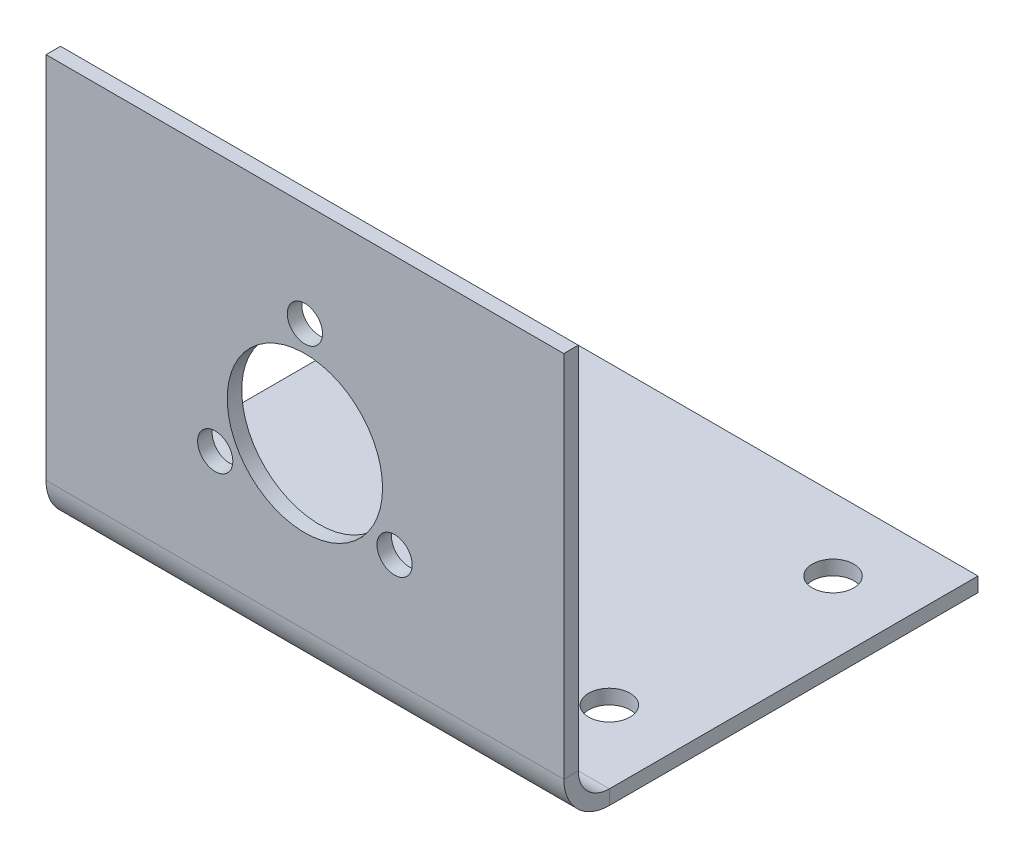
ISO-10303-21;
HEADER;
FILE_DESCRIPTION(('STEP AP214'),'2;1');
FILE_NAME('part.step','',(''),(''),'','','');
FILE_SCHEMA(('AUTOMOTIVE_DESIGN { 1 0 10303 214 1 1 1 1 }'));
ENDSEC;
DATA;
#1=APPLICATION_CONTEXT('core data for automotive mechanical design processes');
#2=APPLICATION_PROTOCOL_DEFINITION('international standard','automotive_design',2000,#1);
#3=PRODUCT_CONTEXT('',#1,'mechanical');
#4=PRODUCT('Part','Part','',(#3));
#5=PRODUCT_RELATED_PRODUCT_CATEGORY('part','',(#4));
#6=PRODUCT_DEFINITION_FORMATION('','',#4);
#7=PRODUCT_DEFINITION_CONTEXT('part definition',#1,'design');
#8=PRODUCT_DEFINITION('design','',#6,#7);
#9=PRODUCT_DEFINITION_SHAPE('','',#8);
#10=(LENGTH_UNIT() NAMED_UNIT(*) SI_UNIT(.MILLI.,.METRE.));
#11=(NAMED_UNIT(*) PLANE_ANGLE_UNIT() SI_UNIT($,.RADIAN.));
#12=(NAMED_UNIT(*) SI_UNIT($,.STERADIAN.) SOLID_ANGLE_UNIT());
#13=UNCERTAINTY_MEASURE_WITH_UNIT(LENGTH_MEASURE(1.E-05),#10,'distance_accuracy_value','');
#14=(GEOMETRIC_REPRESENTATION_CONTEXT(3) GLOBAL_UNCERTAINTY_ASSIGNED_CONTEXT((#13)) GLOBAL_UNIT_ASSIGNED_CONTEXT((#10,
#11,#12)) REPRESENTATION_CONTEXT('',''));
#15=CARTESIAN_POINT('',(0.,0.,0.));
#16=DIRECTION('',(0.,0.,1.));
#17=DIRECTION('',(1.,0.,0.));
#18=AXIS2_PLACEMENT_3D('',#15,#16,#17);
#19=CARTESIAN_POINT('',(0.,0.,-1.4));
#20=DIRECTION('',(-1.,0.,0.));
#21=DIRECTION('',(0.,-1.,0.));
#22=AXIS2_PLACEMENT_3D('',#19,#20,#21);
#23=PLANE('',#22);
#24=DIRECTION('',(0.,-1.,0.));
#25=VECTOR('',#24,1.);
#26=CARTESIAN_POINT('',(0.,0.,-1.4));
#27=LINE('',#26,#25);
#28=CARTESIAN_POINT('',(0.,40.,-1.4));
#29=VERTEX_POINT('',#28);
#30=CARTESIAN_POINT('',(0.,4.39999999999999,-1.4));
#31=VERTEX_POINT('',#30);
#32=EDGE_CURVE('E210',#29,#31,#27,.T.);
#33=ORIENTED_EDGE('',*,*,#32,.T.);
#34=DIRECTION('',(0.,0.,1.));
#35=VECTOR('',#34,1.);
#36=CARTESIAN_POINT('',(0.,4.39999999999999,-1.4));
#37=LINE('',#36,#35);
#38=CARTESIAN_POINT('',(0.,4.39999999999999,0.));
#39=VERTEX_POINT('',#38);
#40=EDGE_CURVE('E173',#31,#39,#37,.T.);
#41=ORIENTED_EDGE('',*,*,#40,.T.);
#42=DIRECTION('',(0.,-1.,0.));
#43=VECTOR('',#42,1.);
#44=CARTESIAN_POINT('',(0.,0.,0.));
#45=LINE('',#44,#43);
#46=CARTESIAN_POINT('',(0.,40.,0.));
#47=VERTEX_POINT('',#46);
#48=EDGE_CURVE('E209',#47,#39,#45,.T.);
#49=ORIENTED_EDGE('',*,*,#48,.F.);
#50=DIRECTION('',(0.,0.,1.));
#51=VECTOR('',#50,1.);
#52=CARTESIAN_POINT('',(0.,40.,-1.4));
#53=LINE('',#52,#51);
#54=EDGE_CURVE('E13',#29,#47,#53,.T.);
#55=ORIENTED_EDGE('',*,*,#54,.F.);
#56=EDGE_LOOP('',(#33,#41,#49,#55));
#57=FACE_BOUND('',#56,.T.);
#58=ADVANCED_FACE('F59',(#57),#23,.T.);
#59=CARTESIAN_POINT('',(0.,0.,-1.4));
#60=DIRECTION('',(0.,0.,-1.));
#61=DIRECTION('',(-1.,0.,0.));
#62=AXIS2_PLACEMENT_3D('',#59,#60,#61);
#63=PLANE('',#62);
#64=CARTESIAN_POINT('',(16.3397459621556,15.,-1.4));
#65=DIRECTION('',(0.,0.,-1.));
#66=DIRECTION('',(-1.,0.,0.));
#67=AXIS2_PLACEMENT_3D('',#64,#65,#66);
#68=CIRCLE('',#67,1.7);
#69=CARTESIAN_POINT('',(18.0397459621556,15.,-1.4));
#70=VERTEX_POINT('',#69);
#71=EDGE_CURVE('E206',#70,#70,#68,.T.);
#72=ORIENTED_EDGE('',*,*,#71,.F.);
#73=EDGE_LOOP('',(#72));
#74=FACE_BOUND('',#73,.T.);
#75=CARTESIAN_POINT('',(25.,30.,-1.4));
#76=DIRECTION('',(0.,0.,-1.));
#77=DIRECTION('',(-1.,0.,0.));
#78=AXIS2_PLACEMENT_3D('',#75,#76,#77);
#79=CIRCLE('',#78,1.7);
#80=CARTESIAN_POINT('',(26.7,30.,-1.4));
#81=VERTEX_POINT('',#80);
#82=EDGE_CURVE('E203',#81,#81,#79,.T.);
#83=ORIENTED_EDGE('',*,*,#82,.F.);
#84=EDGE_LOOP('',(#83));
#85=FACE_BOUND('',#84,.T.);
#86=CARTESIAN_POINT('',(33.6602540378444,15.,-1.4));
#87=DIRECTION('',(0.,0.,-1.));
#88=DIRECTION('',(-1.,0.,0.));
#89=AXIS2_PLACEMENT_3D('',#86,#87,#88);
#90=CIRCLE('',#89,1.69999999999999);
#91=CARTESIAN_POINT('',(35.3602540378444,15.,-1.4));
#92=VERTEX_POINT('',#91);
#93=EDGE_CURVE('E200',#92,#92,#90,.T.);
#94=ORIENTED_EDGE('',*,*,#93,.F.);
#95=EDGE_LOOP('',(#94));
#96=FACE_BOUND('',#95,.T.);
#97=CARTESIAN_POINT('',(25.,20.,-1.4));
#98=DIRECTION('',(0.,0.,-1.));
#99=DIRECTION('',(-1.,0.,0.));
#100=AXIS2_PLACEMENT_3D('',#97,#98,#99);
#101=CIRCLE('',#100,7.49999999999999);
#102=CARTESIAN_POINT('',(32.5,20.,-1.4));
#103=VERTEX_POINT('',#102);
#104=EDGE_CURVE('E197',#103,#103,#101,.T.);
#105=ORIENTED_EDGE('',*,*,#104,.F.);
#106=EDGE_LOOP('',(#105));
#107=FACE_BOUND('',#106,.T.);
#108=DIRECTION('',(0.,1.,0.));
#109=VECTOR('',#108,1.);
#110=CARTESIAN_POINT('',(50.,0.,-1.4));
#111=LINE('',#110,#109);
#112=CARTESIAN_POINT('',(50.,4.39999999999999,-1.4));
#113=VERTEX_POINT('',#112);
#114=CARTESIAN_POINT('',(50.,40.,-1.4));
#115=VERTEX_POINT('',#114);
#116=EDGE_CURVE('E212',#113,#115,#111,.T.);
#117=ORIENTED_EDGE('',*,*,#116,.F.);
#118=DIRECTION('',(-1.,0.,0.));
#119=VECTOR('',#118,1.);
#120=CARTESIAN_POINT('',(0.,4.39999999999999,-1.4));
#121=LINE('',#120,#119);
#122=EDGE_CURVE('E80',#31,#113,#121,.F.);
#123=ORIENTED_EDGE('',*,*,#122,.F.);
#124=ORIENTED_EDGE('',*,*,#32,.F.);
#125=DIRECTION('',(-1.,0.,0.));
#126=VECTOR('',#125,1.);
#127=CARTESIAN_POINT('',(0.,40.,-1.4));
#128=LINE('',#127,#126);
#129=EDGE_CURVE('E215',#115,#29,#128,.T.);
#130=ORIENTED_EDGE('',*,*,#129,.F.);
#131=EDGE_LOOP('',(#117,#123,#124,#130));
#132=FACE_BOUND('',#131,.T.);
#133=ADVANCED_FACE('F266',(#74,#85,#96,#107,#132),#63,.T.);
#134=CARTESIAN_POINT('',(0.,0.,0.));
#135=DIRECTION('',(0.,0.,-1.));
#136=DIRECTION('',(-1.,0.,0.));
#137=AXIS2_PLACEMENT_3D('',#134,#135,#136);
#138=PLANE('',#137);
#139=CARTESIAN_POINT('',(25.,20.,0.));
#140=DIRECTION('',(0.,0.,1.));
#141=DIRECTION('',(1.,0.,0.));
#142=AXIS2_PLACEMENT_3D('',#139,#140,#141);
#143=CIRCLE('',#142,7.49999999999999);
#144=CARTESIAN_POINT('',(32.5,20.,0.));
#145=VERTEX_POINT('',#144);
#146=EDGE_CURVE('E189',#145,#145,#143,.T.);
#147=ORIENTED_EDGE('',*,*,#146,.F.);
#148=EDGE_LOOP('',(#147));
#149=FACE_BOUND('',#148,.T.);
#150=CARTESIAN_POINT('',(33.6602540378444,15.,0.));
#151=DIRECTION('',(0.,0.,1.));
#152=DIRECTION('',(1.,0.,0.));
#153=AXIS2_PLACEMENT_3D('',#150,#151,#152);
#154=CIRCLE('',#153,1.69999999999999);
#155=CARTESIAN_POINT('',(35.3602540378444,15.,0.));
#156=VERTEX_POINT('',#155);
#157=EDGE_CURVE('E186',#156,#156,#154,.T.);
#158=ORIENTED_EDGE('',*,*,#157,.F.);
#159=EDGE_LOOP('',(#158));
#160=FACE_BOUND('',#159,.T.);
#161=CARTESIAN_POINT('',(25.,30.,0.));
#162=DIRECTION('',(0.,0.,1.));
#163=DIRECTION('',(1.,0.,0.));
#164=AXIS2_PLACEMENT_3D('',#161,#162,#163);
#165=CIRCLE('',#164,1.7);
#166=CARTESIAN_POINT('',(26.7,30.,0.));
#167=VERTEX_POINT('',#166);
#168=EDGE_CURVE('E190',#167,#167,#165,.T.);
#169=ORIENTED_EDGE('',*,*,#168,.F.);
#170=EDGE_LOOP('',(#169));
#171=FACE_BOUND('',#170,.T.);
#172=CARTESIAN_POINT('',(16.3397459621556,15.,0.));
#173=DIRECTION('',(0.,0.,1.));
#174=DIRECTION('',(1.,0.,0.));
#175=AXIS2_PLACEMENT_3D('',#172,#173,#174);
#176=CIRCLE('',#175,1.7);
#177=CARTESIAN_POINT('',(18.0397459621556,15.,0.));
#178=VERTEX_POINT('',#177);
#179=EDGE_CURVE('E184',#178,#178,#176,.T.);
#180=ORIENTED_EDGE('',*,*,#179,.F.);
#181=EDGE_LOOP('',(#180));
#182=FACE_BOUND('',#181,.T.);
#183=DIRECTION('',(-1.,0.,0.));
#184=VECTOR('',#183,1.);
#185=CARTESIAN_POINT('',(0.,4.39999999999999,0.));
#186=LINE('',#185,#184);
#187=CARTESIAN_POINT('',(50.,4.39999999999999,0.));
#188=VERTEX_POINT('',#187);
#189=EDGE_CURVE('E167',#39,#188,#186,.F.);
#190=ORIENTED_EDGE('',*,*,#189,.T.);
#191=DIRECTION('',(0.,1.,0.));
#192=VECTOR('',#191,1.);
#193=CARTESIAN_POINT('',(50.,0.,0.));
#194=LINE('',#193,#192);
#195=CARTESIAN_POINT('',(50.,40.,0.));
#196=VERTEX_POINT('',#195);
#197=EDGE_CURVE('E220',#188,#196,#194,.T.);
#198=ORIENTED_EDGE('',*,*,#197,.T.);
#199=DIRECTION('',(-1.,0.,0.));
#200=VECTOR('',#199,1.);
#201=CARTESIAN_POINT('',(0.,40.,0.));
#202=LINE('',#201,#200);
#203=EDGE_CURVE('E213',#196,#47,#202,.T.);
#204=ORIENTED_EDGE('',*,*,#203,.T.);
#205=ORIENTED_EDGE('',*,*,#48,.T.);
#206=EDGE_LOOP('',(#190,#198,#204,#205));
#207=FACE_BOUND('',#206,.T.);
#208=ADVANCED_FACE('F225',(#149,#160,#171,#182,#207),#138,.F.);
#209=CARTESIAN_POINT('',(0.,40.,-1.4));
#210=DIRECTION('',(0.,1.,0.));
#211=DIRECTION('',(0.,0.,1.));
#212=AXIS2_PLACEMENT_3D('',#209,#210,#211);
#213=PLANE('',#212);
#214=ORIENTED_EDGE('',*,*,#203,.F.);
#215=DIRECTION('',(0.,0.,1.));
#216=VECTOR('',#215,1.);
#217=CARTESIAN_POINT('',(50.,40.,-1.4));
#218=LINE('',#217,#216);
#219=EDGE_CURVE('E62',#115,#196,#218,.T.);
#220=ORIENTED_EDGE('',*,*,#219,.F.);
#221=ORIENTED_EDGE('',*,*,#129,.T.);
#222=ORIENTED_EDGE('',*,*,#54,.T.);
#223=EDGE_LOOP('',(#214,#220,#221,#222));
#224=FACE_BOUND('',#223,.T.);
#225=ADVANCED_FACE('F231',(#224),#213,.T.);
#226=CARTESIAN_POINT('',(50.,0.,-1.4));
#227=DIRECTION('',(1.,0.,0.));
#228=DIRECTION('',(0.,0.,-1.));
#229=AXIS2_PLACEMENT_3D('',#226,#227,#228);
#230=PLANE('',#229);
#231=DIRECTION('',(0.,0.,1.));
#232=VECTOR('',#231,1.);
#233=CARTESIAN_POINT('',(50.,4.39999999999999,-1.4));
#234=LINE('',#233,#232);
#235=EDGE_CURVE('E73',#113,#188,#234,.T.);
#236=ORIENTED_EDGE('',*,*,#235,.F.);
#237=ORIENTED_EDGE('',*,*,#116,.T.);
#238=ORIENTED_EDGE('',*,*,#219,.T.);
#239=ORIENTED_EDGE('',*,*,#197,.F.);
#240=EDGE_LOOP('',(#236,#237,#238,#239));
#241=FACE_BOUND('',#240,.T.);
#242=ADVANCED_FACE('F283',(#241),#230,.T.);
#243=CARTESIAN_POINT('',(25.,20.,-1.400012));
#244=DIRECTION('',(0.,0.,1.));
#245=DIRECTION('',(1.,0.,0.));
#246=AXIS2_PLACEMENT_3D('',#243,#244,#245);
#247=CYLINDRICAL_SURFACE('',#246,7.49999999999999);
#248=CARTESIAN_POINT('',(32.5,20.,-1.4));
#249=CARTESIAN_POINT('',(32.5,20.,-1.38541666666667));
#250=CARTESIAN_POINT('',(32.5,20.,-1.37083333333333));
#251=CARTESIAN_POINT('',(32.5,20.,-1.34166666666667));
#252=CARTESIAN_POINT('',(32.5,20.,-1.32708333333333));
#253=CARTESIAN_POINT('',(32.5,20.,-1.29791666666667));
#254=CARTESIAN_POINT('',(32.5,20.,-1.28333333333333));
#255=CARTESIAN_POINT('',(32.5,20.,-1.25416666666667));
#256=CARTESIAN_POINT('',(32.5,20.,-1.23958333333333));
#257=CARTESIAN_POINT('',(32.5,20.,-1.21041666666667));
#258=CARTESIAN_POINT('',(32.5,20.,-1.19583333333333));
#259=CARTESIAN_POINT('',(32.5,20.,-1.16666666666667));
#260=CARTESIAN_POINT('',(32.5,20.,-1.15208333333333));
#261=CARTESIAN_POINT('',(32.5,20.,-1.12291666666667));
#262=CARTESIAN_POINT('',(32.5,20.,-1.10833333333333));
#263=CARTESIAN_POINT('',(32.5,20.,-1.07916666666667));
#264=CARTESIAN_POINT('',(32.5,20.,-1.06458333333333));
#265=CARTESIAN_POINT('',(32.5,20.,-1.03541666666667));
#266=CARTESIAN_POINT('',(32.5,20.,-1.02083333333333));
#267=CARTESIAN_POINT('',(32.5,20.,-0.991666666666667));
#268=CARTESIAN_POINT('',(32.5,20.,-0.977083333333333));
#269=CARTESIAN_POINT('',(32.5,20.,-0.947916666666667));
#270=CARTESIAN_POINT('',(32.5,20.,-0.933333333333333));
#271=CARTESIAN_POINT('',(32.5,20.,-0.904166666666667));
#272=CARTESIAN_POINT('',(32.5,20.,-0.889583333333334));
#273=CARTESIAN_POINT('',(32.5,20.,-0.860416666666667));
#274=CARTESIAN_POINT('',(32.5,20.,-0.845833333333333));
#275=CARTESIAN_POINT('',(32.5,20.,-0.816666666666667));
#276=CARTESIAN_POINT('',(32.5,20.,-0.802083333333333));
#277=CARTESIAN_POINT('',(32.5,20.,-0.772916666666667));
#278=CARTESIAN_POINT('',(32.5,20.,-0.758333333333333));
#279=CARTESIAN_POINT('',(32.5,20.,-0.729166666666667));
#280=CARTESIAN_POINT('',(32.5,20.,-0.714583333333333));
#281=CARTESIAN_POINT('',(32.5,20.,-0.685416666666667));
#282=CARTESIAN_POINT('',(32.5,20.,-0.670833333333334));
#283=CARTESIAN_POINT('',(32.5,20.,-0.641666666666667));
#284=CARTESIAN_POINT('',(32.5,20.,-0.627083333333333));
#285=CARTESIAN_POINT('',(32.5,20.,-0.597916666666667));
#286=CARTESIAN_POINT('',(32.5,20.,-0.583333333333333));
#287=CARTESIAN_POINT('',(32.5,20.,-0.554166666666667));
#288=CARTESIAN_POINT('',(32.5,20.,-0.539583333333333));
#289=CARTESIAN_POINT('',(32.5,20.,-0.510416666666667));
#290=CARTESIAN_POINT('',(32.5,20.,-0.495833333333333));
#291=CARTESIAN_POINT('',(32.5,20.,-0.466666666666667));
#292=CARTESIAN_POINT('',(32.5,20.,-0.452083333333333));
#293=CARTESIAN_POINT('',(32.5,20.,-0.422916666666667));
#294=CARTESIAN_POINT('',(32.5,20.,-0.408333333333333));
#295=CARTESIAN_POINT('',(32.5,20.,-0.379166666666667));
#296=CARTESIAN_POINT('',(32.5,20.,-0.364583333333334));
#297=CARTESIAN_POINT('',(32.5,20.,-0.335416666666667));
#298=CARTESIAN_POINT('',(32.5,20.,-0.320833333333334));
#299=CARTESIAN_POINT('',(32.5,20.,-0.291666666666667));
#300=CARTESIAN_POINT('',(32.5,20.,-0.277083333333334));
#301=CARTESIAN_POINT('',(32.5,20.,-0.247916666666667));
#302=CARTESIAN_POINT('',(32.5,20.,-0.233333333333334));
#303=CARTESIAN_POINT('',(32.5,20.,-0.204166666666667));
#304=CARTESIAN_POINT('',(32.5,20.,-0.189583333333334));
#305=CARTESIAN_POINT('',(32.5,20.,-0.160416666666667));
#306=CARTESIAN_POINT('',(32.5,20.,-0.145833333333334));
#307=CARTESIAN_POINT('',(32.5,20.,-0.116666666666667));
#308=CARTESIAN_POINT('',(32.5,20.,-0.102083333333334));
#309=CARTESIAN_POINT('',(32.5,20.,-0.0729166666666668));
#310=CARTESIAN_POINT('',(32.5,20.,-0.0583333333333335));
#311=CARTESIAN_POINT('',(32.5,20.,-0.0291666666666669));
#312=CARTESIAN_POINT('',(32.5,20.,-0.0145833333333335));
#313=CARTESIAN_POINT('',(32.5,20.,0.));
#314=B_SPLINE_CURVE_WITH_KNOTS('',3,(#248,#249,#250,#251,#252,#253,#254,#255,#256,#257,#258,
#259,#260,#261,#262,#263,#264,#265,#266,#267,#268,#269,#270,#271,#272,#273,#274,#275,#276,#277,
#278,#279,#280,#281,#282,#283,#284,#285,#286,#287,#288,#289,#290,#291,#292,#293,#294,#295,#296,
#297,#298,#299,#300,#301,#302,#303,#304,#305,#306,#307,#308,#309,#310,#311,#312,#313),
.UNSPECIFIED.,.F.,.F.,(4,2,2,2,2,2,2,2,2,2,2,2,2,2,2,2,2,2,2,2,2,2,2,2,2,2,2,2,2,2,2,2,4),(0.,
0.0437500000000002,0.0875000000000001,0.13125,0.175,0.21875,0.2625,0.30625,0.35,0.39375,0.4375,
0.48125,0.525,0.56875,0.6125,0.65625,0.7,0.74375,0.7875,0.83125,0.875,0.91875,0.9625,1.00625,
1.05,1.09375,1.1375,1.18125,1.225,1.26875,1.3125,1.35625,1.4),.UNSPECIFIED.);
#315=EDGE_CURVE('BSEAM280',#103,#145,#314,.T.);
#316=ORIENTED_EDGE('',*,*,#104,.T.);
#317=ORIENTED_EDGE('',*,*,#146,.T.);
#318=ORIENTED_EDGE('',*,*,#315,.T.);
#319=ORIENTED_EDGE('',*,*,#315,.F.);
#320=EDGE_LOOP('',(#316,#318,#317,#319));
#321=FACE_BOUND('',#320,.T.);
#322=ADVANCED_FACE('F280',(#321),#247,.F.);
#323=CARTESIAN_POINT('',(33.6602540378444,15.,-1.400012));
#324=DIRECTION('',(0.,0.,1.));
#325=DIRECTION('',(1.,0.,0.));
#326=AXIS2_PLACEMENT_3D('',#323,#324,#325);
#327=CYLINDRICAL_SURFACE('',#326,1.69999999999999);
#328=CARTESIAN_POINT('',(35.3602540378444,15.,-1.4));
#329=CARTESIAN_POINT('',(35.3602540378444,15.,-1.38541666666667));
#330=CARTESIAN_POINT('',(35.3602540378444,15.,-1.37083333333333));
#331=CARTESIAN_POINT('',(35.3602540378444,15.,-1.34166666666667));
#332=CARTESIAN_POINT('',(35.3602540378444,15.,-1.32708333333333));
#333=CARTESIAN_POINT('',(35.3602540378444,15.,-1.29791666666667));
#334=CARTESIAN_POINT('',(35.3602540378444,15.,-1.28333333333333));
#335=CARTESIAN_POINT('',(35.3602540378444,15.,-1.25416666666667));
#336=CARTESIAN_POINT('',(35.3602540378444,15.,-1.23958333333333));
#337=CARTESIAN_POINT('',(35.3602540378444,15.,-1.21041666666667));
#338=CARTESIAN_POINT('',(35.3602540378444,15.,-1.19583333333333));
#339=CARTESIAN_POINT('',(35.3602540378444,15.,-1.16666666666667));
#340=CARTESIAN_POINT('',(35.3602540378444,15.,-1.15208333333333));
#341=CARTESIAN_POINT('',(35.3602540378444,15.,-1.12291666666667));
#342=CARTESIAN_POINT('',(35.3602540378444,15.,-1.10833333333333));
#343=CARTESIAN_POINT('',(35.3602540378444,15.,-1.07916666666667));
#344=CARTESIAN_POINT('',(35.3602540378444,15.,-1.06458333333333));
#345=CARTESIAN_POINT('',(35.3602540378444,15.,-1.03541666666667));
#346=CARTESIAN_POINT('',(35.3602540378444,15.,-1.02083333333333));
#347=CARTESIAN_POINT('',(35.3602540378444,15.,-0.991666666666667));
#348=CARTESIAN_POINT('',(35.3602540378444,15.,-0.977083333333333));
#349=CARTESIAN_POINT('',(35.3602540378444,15.,-0.947916666666667));
#350=CARTESIAN_POINT('',(35.3602540378444,15.,-0.933333333333333));
#351=CARTESIAN_POINT('',(35.3602540378444,15.,-0.904166666666667));
#352=CARTESIAN_POINT('',(35.3602540378444,15.,-0.889583333333334));
#353=CARTESIAN_POINT('',(35.3602540378444,15.,-0.860416666666667));
#354=CARTESIAN_POINT('',(35.3602540378444,15.,-0.845833333333333));
#355=CARTESIAN_POINT('',(35.3602540378444,15.,-0.816666666666667));
#356=CARTESIAN_POINT('',(35.3602540378444,15.,-0.802083333333333));
#357=CARTESIAN_POINT('',(35.3602540378444,15.,-0.772916666666667));
#358=CARTESIAN_POINT('',(35.3602540378444,15.,-0.758333333333333));
#359=CARTESIAN_POINT('',(35.3602540378444,15.,-0.729166666666667));
#360=CARTESIAN_POINT('',(35.3602540378444,15.,-0.714583333333333));
#361=CARTESIAN_POINT('',(35.3602540378444,15.,-0.685416666666667));
#362=CARTESIAN_POINT('',(35.3602540378444,15.,-0.670833333333334));
#363=CARTESIAN_POINT('',(35.3602540378444,15.,-0.641666666666667));
#364=CARTESIAN_POINT('',(35.3602540378444,15.,-0.627083333333333));
#365=CARTESIAN_POINT('',(35.3602540378444,15.,-0.597916666666667));
#366=CARTESIAN_POINT('',(35.3602540378444,15.,-0.583333333333333));
#367=CARTESIAN_POINT('',(35.3602540378444,15.,-0.554166666666667));
#368=CARTESIAN_POINT('',(35.3602540378444,15.,-0.539583333333333));
#369=CARTESIAN_POINT('',(35.3602540378444,15.,-0.510416666666667));
#370=CARTESIAN_POINT('',(35.3602540378444,15.,-0.495833333333333));
#371=CARTESIAN_POINT('',(35.3602540378444,15.,-0.466666666666667));
#372=CARTESIAN_POINT('',(35.3602540378444,15.,-0.452083333333333));
#373=CARTESIAN_POINT('',(35.3602540378444,15.,-0.422916666666667));
#374=CARTESIAN_POINT('',(35.3602540378444,15.,-0.408333333333333));
#375=CARTESIAN_POINT('',(35.3602540378444,15.,-0.379166666666667));
#376=CARTESIAN_POINT('',(35.3602540378444,15.,-0.364583333333334));
#377=CARTESIAN_POINT('',(35.3602540378444,15.,-0.335416666666667));
#378=CARTESIAN_POINT('',(35.3602540378444,15.,-0.320833333333334));
#379=CARTESIAN_POINT('',(35.3602540378444,15.,-0.291666666666667));
#380=CARTESIAN_POINT('',(35.3602540378444,15.,-0.277083333333334));
#381=CARTESIAN_POINT('',(35.3602540378444,15.,-0.247916666666667));
#382=CARTESIAN_POINT('',(35.3602540378444,15.,-0.233333333333334));
#383=CARTESIAN_POINT('',(35.3602540378444,15.,-0.204166666666667));
#384=CARTESIAN_POINT('',(35.3602540378444,15.,-0.189583333333334));
#385=CARTESIAN_POINT('',(35.3602540378444,15.,-0.160416666666667));
#386=CARTESIAN_POINT('',(35.3602540378444,15.,-0.145833333333334));
#387=CARTESIAN_POINT('',(35.3602540378444,15.,-0.116666666666667));
#388=CARTESIAN_POINT('',(35.3602540378444,15.,-0.102083333333334));
#389=CARTESIAN_POINT('',(35.3602540378444,15.,-0.0729166666666668));
#390=CARTESIAN_POINT('',(35.3602540378444,15.,-0.0583333333333335));
#391=CARTESIAN_POINT('',(35.3602540378444,15.,-0.0291666666666669));
#392=CARTESIAN_POINT('',(35.3602540378444,15.,-0.0145833333333335));
#393=CARTESIAN_POINT('',(35.3602540378444,15.,0.));
#394=B_SPLINE_CURVE_WITH_KNOTS('',3,(#328,#329,#330,#331,#332,#333,#334,#335,#336,#337,#338,
#339,#340,#341,#342,#343,#344,#345,#346,#347,#348,#349,#350,#351,#352,#353,#354,#355,#356,#357,
#358,#359,#360,#361,#362,#363,#364,#365,#366,#367,#368,#369,#370,#371,#372,#373,#374,#375,#376,
#377,#378,#379,#380,#381,#382,#383,#384,#385,#386,#387,#388,#389,#390,#391,#392,#393),
.UNSPECIFIED.,.F.,.F.,(4,2,2,2,2,2,2,2,2,2,2,2,2,2,2,2,2,2,2,2,2,2,2,2,2,2,2,2,2,2,2,2,4),(0.,
0.0437500000000002,0.0875000000000001,0.13125,0.175,0.21875,0.2625,0.30625,0.35,0.39375,0.4375,
0.48125,0.525,0.56875,0.6125,0.65625,0.7,0.74375,0.7875,0.83125,0.875,0.91875,0.9625,1.00625,
1.05,1.09375,1.1375,1.18125,1.225,1.26875,1.3125,1.35625,1.4),.UNSPECIFIED.);
#395=EDGE_CURVE('BSEAM288',#92,#156,#394,.T.);
#396=ORIENTED_EDGE('',*,*,#93,.T.);
#397=ORIENTED_EDGE('',*,*,#157,.T.);
#398=ORIENTED_EDGE('',*,*,#395,.T.);
#399=ORIENTED_EDGE('',*,*,#395,.F.);
#400=EDGE_LOOP('',(#396,#398,#397,#399));
#401=FACE_BOUND('',#400,.T.);
#402=ADVANCED_FACE('F288',(#401),#327,.F.);
#403=CARTESIAN_POINT('',(25.,30.,-1.400012));
#404=DIRECTION('',(0.,0.,1.));
#405=DIRECTION('',(1.,0.,0.));
#406=AXIS2_PLACEMENT_3D('',#403,#404,#405);
#407=CYLINDRICAL_SURFACE('',#406,1.7);
#408=CARTESIAN_POINT('',(26.7,30.,-1.4));
#409=CARTESIAN_POINT('',(26.7,30.,-1.38541666666667));
#410=CARTESIAN_POINT('',(26.7,30.,-1.37083333333333));
#411=CARTESIAN_POINT('',(26.7,30.,-1.34166666666667));
#412=CARTESIAN_POINT('',(26.7,30.,-1.32708333333333));
#413=CARTESIAN_POINT('',(26.7,30.,-1.29791666666667));
#414=CARTESIAN_POINT('',(26.7,30.,-1.28333333333333));
#415=CARTESIAN_POINT('',(26.7,30.,-1.25416666666667));
#416=CARTESIAN_POINT('',(26.7,30.,-1.23958333333333));
#417=CARTESIAN_POINT('',(26.7,30.,-1.21041666666667));
#418=CARTESIAN_POINT('',(26.7,30.,-1.19583333333333));
#419=CARTESIAN_POINT('',(26.7,30.,-1.16666666666667));
#420=CARTESIAN_POINT('',(26.7,30.,-1.15208333333333));
#421=CARTESIAN_POINT('',(26.7,30.,-1.12291666666667));
#422=CARTESIAN_POINT('',(26.7,30.,-1.10833333333333));
#423=CARTESIAN_POINT('',(26.7,30.,-1.07916666666667));
#424=CARTESIAN_POINT('',(26.7,30.,-1.06458333333333));
#425=CARTESIAN_POINT('',(26.7,30.,-1.03541666666667));
#426=CARTESIAN_POINT('',(26.7,30.,-1.02083333333333));
#427=CARTESIAN_POINT('',(26.7,30.,-0.991666666666667));
#428=CARTESIAN_POINT('',(26.7,30.,-0.977083333333333));
#429=CARTESIAN_POINT('',(26.7,30.,-0.947916666666667));
#430=CARTESIAN_POINT('',(26.7,30.,-0.933333333333333));
#431=CARTESIAN_POINT('',(26.7,30.,-0.904166666666667));
#432=CARTESIAN_POINT('',(26.7,30.,-0.889583333333334));
#433=CARTESIAN_POINT('',(26.7,30.,-0.860416666666667));
#434=CARTESIAN_POINT('',(26.7,30.,-0.845833333333333));
#435=CARTESIAN_POINT('',(26.7,30.,-0.816666666666667));
#436=CARTESIAN_POINT('',(26.7,30.,-0.802083333333333));
#437=CARTESIAN_POINT('',(26.7,30.,-0.772916666666667));
#438=CARTESIAN_POINT('',(26.7,30.,-0.758333333333333));
#439=CARTESIAN_POINT('',(26.7,30.,-0.729166666666667));
#440=CARTESIAN_POINT('',(26.7,30.,-0.714583333333333));
#441=CARTESIAN_POINT('',(26.7,30.,-0.685416666666667));
#442=CARTESIAN_POINT('',(26.7,30.,-0.670833333333334));
#443=CARTESIAN_POINT('',(26.7,30.,-0.641666666666667));
#444=CARTESIAN_POINT('',(26.7,30.,-0.627083333333333));
#445=CARTESIAN_POINT('',(26.7,30.,-0.597916666666667));
#446=CARTESIAN_POINT('',(26.7,30.,-0.583333333333333));
#447=CARTESIAN_POINT('',(26.7,30.,-0.554166666666667));
#448=CARTESIAN_POINT('',(26.7,30.,-0.539583333333333));
#449=CARTESIAN_POINT('',(26.7,30.,-0.510416666666667));
#450=CARTESIAN_POINT('',(26.7,30.,-0.495833333333333));
#451=CARTESIAN_POINT('',(26.7,30.,-0.466666666666667));
#452=CARTESIAN_POINT('',(26.7,30.,-0.452083333333333));
#453=CARTESIAN_POINT('',(26.7,30.,-0.422916666666667));
#454=CARTESIAN_POINT('',(26.7,30.,-0.408333333333333));
#455=CARTESIAN_POINT('',(26.7,30.,-0.379166666666667));
#456=CARTESIAN_POINT('',(26.7,30.,-0.364583333333334));
#457=CARTESIAN_POINT('',(26.7,30.,-0.335416666666667));
#458=CARTESIAN_POINT('',(26.7,30.,-0.320833333333334));
#459=CARTESIAN_POINT('',(26.7,30.,-0.291666666666667));
#460=CARTESIAN_POINT('',(26.7,30.,-0.277083333333334));
#461=CARTESIAN_POINT('',(26.7,30.,-0.247916666666667));
#462=CARTESIAN_POINT('',(26.7,30.,-0.233333333333334));
#463=CARTESIAN_POINT('',(26.7,30.,-0.204166666666667));
#464=CARTESIAN_POINT('',(26.7,30.,-0.189583333333334));
#465=CARTESIAN_POINT('',(26.7,30.,-0.160416666666667));
#466=CARTESIAN_POINT('',(26.7,30.,-0.145833333333334));
#467=CARTESIAN_POINT('',(26.7,30.,-0.116666666666667));
#468=CARTESIAN_POINT('',(26.7,30.,-0.102083333333334));
#469=CARTESIAN_POINT('',(26.7,30.,-0.0729166666666668));
#470=CARTESIAN_POINT('',(26.7,30.,-0.0583333333333335));
#471=CARTESIAN_POINT('',(26.7,30.,-0.0291666666666669));
#472=CARTESIAN_POINT('',(26.7,30.,-0.0145833333333335));
#473=CARTESIAN_POINT('',(26.7,30.,0.));
#474=B_SPLINE_CURVE_WITH_KNOTS('',3,(#408,#409,#410,#411,#412,#413,#414,#415,#416,#417,#418,
#419,#420,#421,#422,#423,#424,#425,#426,#427,#428,#429,#430,#431,#432,#433,#434,#435,#436,#437,
#438,#439,#440,#441,#442,#443,#444,#445,#446,#447,#448,#449,#450,#451,#452,#453,#454,#455,#456,
#457,#458,#459,#460,#461,#462,#463,#464,#465,#466,#467,#468,#469,#470,#471,#472,#473),
.UNSPECIFIED.,.F.,.F.,(4,2,2,2,2,2,2,2,2,2,2,2,2,2,2,2,2,2,2,2,2,2,2,2,2,2,2,2,2,2,2,2,4),(0.,
0.0437500000000002,0.0875000000000001,0.13125,0.175,0.21875,0.2625,0.30625,0.35,0.39375,0.4375,
0.48125,0.525,0.56875,0.6125,0.65625,0.7,0.74375,0.7875,0.83125,0.875,0.91875,0.9625,1.00625,
1.05,1.09375,1.1375,1.18125,1.225,1.26875,1.3125,1.35625,1.4),.UNSPECIFIED.);
#475=EDGE_CURVE('BSEAM261',#81,#167,#474,.T.);
#476=ORIENTED_EDGE('',*,*,#82,.T.);
#477=ORIENTED_EDGE('',*,*,#168,.T.);
#478=ORIENTED_EDGE('',*,*,#475,.T.);
#479=ORIENTED_EDGE('',*,*,#475,.F.);
#480=EDGE_LOOP('',(#476,#478,#477,#479));
#481=FACE_BOUND('',#480,.T.);
#482=ADVANCED_FACE('F261',(#481),#407,.F.);
#483=CARTESIAN_POINT('',(16.3397459621556,15.,-1.400012));
#484=DIRECTION('',(0.,0.,1.));
#485=DIRECTION('',(1.,0.,0.));
#486=AXIS2_PLACEMENT_3D('',#483,#484,#485);
#487=CYLINDRICAL_SURFACE('',#486,1.7);
#488=CARTESIAN_POINT('',(18.0397459621556,15.,-1.4));
#489=CARTESIAN_POINT('',(18.0397459621556,15.,-1.38541666666667));
#490=CARTESIAN_POINT('',(18.0397459621556,15.,-1.37083333333333));
#491=CARTESIAN_POINT('',(18.0397459621556,15.,-1.34166666666667));
#492=CARTESIAN_POINT('',(18.0397459621556,15.,-1.32708333333333));
#493=CARTESIAN_POINT('',(18.0397459621556,15.,-1.29791666666667));
#494=CARTESIAN_POINT('',(18.0397459621556,15.,-1.28333333333333));
#495=CARTESIAN_POINT('',(18.0397459621556,15.,-1.25416666666667));
#496=CARTESIAN_POINT('',(18.0397459621556,15.,-1.23958333333333));
#497=CARTESIAN_POINT('',(18.0397459621556,15.,-1.21041666666667));
#498=CARTESIAN_POINT('',(18.0397459621556,15.,-1.19583333333333));
#499=CARTESIAN_POINT('',(18.0397459621556,15.,-1.16666666666667));
#500=CARTESIAN_POINT('',(18.0397459621556,15.,-1.15208333333333));
#501=CARTESIAN_POINT('',(18.0397459621556,15.,-1.12291666666667));
#502=CARTESIAN_POINT('',(18.0397459621556,15.,-1.10833333333333));
#503=CARTESIAN_POINT('',(18.0397459621556,15.,-1.07916666666667));
#504=CARTESIAN_POINT('',(18.0397459621556,15.,-1.06458333333333));
#505=CARTESIAN_POINT('',(18.0397459621556,15.,-1.03541666666667));
#506=CARTESIAN_POINT('',(18.0397459621556,15.,-1.02083333333333));
#507=CARTESIAN_POINT('',(18.0397459621556,15.,-0.991666666666667));
#508=CARTESIAN_POINT('',(18.0397459621556,15.,-0.977083333333333));
#509=CARTESIAN_POINT('',(18.0397459621556,15.,-0.947916666666667));
#510=CARTESIAN_POINT('',(18.0397459621556,15.,-0.933333333333333));
#511=CARTESIAN_POINT('',(18.0397459621556,15.,-0.904166666666667));
#512=CARTESIAN_POINT('',(18.0397459621556,15.,-0.889583333333334));
#513=CARTESIAN_POINT('',(18.0397459621556,15.,-0.860416666666667));
#514=CARTESIAN_POINT('',(18.0397459621556,15.,-0.845833333333333));
#515=CARTESIAN_POINT('',(18.0397459621556,15.,-0.816666666666667));
#516=CARTESIAN_POINT('',(18.0397459621556,15.,-0.802083333333333));
#517=CARTESIAN_POINT('',(18.0397459621556,15.,-0.772916666666667));
#518=CARTESIAN_POINT('',(18.0397459621556,15.,-0.758333333333333));
#519=CARTESIAN_POINT('',(18.0397459621556,15.,-0.729166666666667));
#520=CARTESIAN_POINT('',(18.0397459621556,15.,-0.714583333333333));
#521=CARTESIAN_POINT('',(18.0397459621556,15.,-0.685416666666667));
#522=CARTESIAN_POINT('',(18.0397459621556,15.,-0.670833333333334));
#523=CARTESIAN_POINT('',(18.0397459621556,15.,-0.641666666666667));
#524=CARTESIAN_POINT('',(18.0397459621556,15.,-0.627083333333333));
#525=CARTESIAN_POINT('',(18.0397459621556,15.,-0.597916666666667));
#526=CARTESIAN_POINT('',(18.0397459621556,15.,-0.583333333333333));
#527=CARTESIAN_POINT('',(18.0397459621556,15.,-0.554166666666667));
#528=CARTESIAN_POINT('',(18.0397459621556,15.,-0.539583333333333));
#529=CARTESIAN_POINT('',(18.0397459621556,15.,-0.510416666666667));
#530=CARTESIAN_POINT('',(18.0397459621556,15.,-0.495833333333333));
#531=CARTESIAN_POINT('',(18.0397459621556,15.,-0.466666666666667));
#532=CARTESIAN_POINT('',(18.0397459621556,15.,-0.452083333333333));
#533=CARTESIAN_POINT('',(18.0397459621556,15.,-0.422916666666667));
#534=CARTESIAN_POINT('',(18.0397459621556,15.,-0.408333333333333));
#535=CARTESIAN_POINT('',(18.0397459621556,15.,-0.379166666666667));
#536=CARTESIAN_POINT('',(18.0397459621556,15.,-0.364583333333334));
#537=CARTESIAN_POINT('',(18.0397459621556,15.,-0.335416666666667));
#538=CARTESIAN_POINT('',(18.0397459621556,15.,-0.320833333333334));
#539=CARTESIAN_POINT('',(18.0397459621556,15.,-0.291666666666667));
#540=CARTESIAN_POINT('',(18.0397459621556,15.,-0.277083333333334));
#541=CARTESIAN_POINT('',(18.0397459621556,15.,-0.247916666666667));
#542=CARTESIAN_POINT('',(18.0397459621556,15.,-0.233333333333334));
#543=CARTESIAN_POINT('',(18.0397459621556,15.,-0.204166666666667));
#544=CARTESIAN_POINT('',(18.0397459621556,15.,-0.189583333333334));
#545=CARTESIAN_POINT('',(18.0397459621556,15.,-0.160416666666667));
#546=CARTESIAN_POINT('',(18.0397459621556,15.,-0.145833333333334));
#547=CARTESIAN_POINT('',(18.0397459621556,15.,-0.116666666666667));
#548=CARTESIAN_POINT('',(18.0397459621556,15.,-0.102083333333334));
#549=CARTESIAN_POINT('',(18.0397459621556,15.,-0.0729166666666668));
#550=CARTESIAN_POINT('',(18.0397459621556,15.,-0.0583333333333335));
#551=CARTESIAN_POINT('',(18.0397459621556,15.,-0.0291666666666669));
#552=CARTESIAN_POINT('',(18.0397459621556,15.,-0.0145833333333335));
#553=CARTESIAN_POINT('',(18.0397459621556,15.,0.));
#554=B_SPLINE_CURVE_WITH_KNOTS('',3,(#488,#489,#490,#491,#492,#493,#494,#495,#496,#497,#498,
#499,#500,#501,#502,#503,#504,#505,#506,#507,#508,#509,#510,#511,#512,#513,#514,#515,#516,#517,
#518,#519,#520,#521,#522,#523,#524,#525,#526,#527,#528,#529,#530,#531,#532,#533,#534,#535,#536,
#537,#538,#539,#540,#541,#542,#543,#544,#545,#546,#547,#548,#549,#550,#551,#552,#553),
.UNSPECIFIED.,.F.,.F.,(4,2,2,2,2,2,2,2,2,2,2,2,2,2,2,2,2,2,2,2,2,2,2,2,2,2,2,2,2,2,2,2,4),(0.,
0.0437500000000002,0.0875000000000001,0.13125,0.175,0.21875,0.2625,0.30625,0.35,0.39375,0.4375,
0.48125,0.525,0.56875,0.6125,0.65625,0.7,0.74375,0.7875,0.83125,0.875,0.91875,0.9625,1.00625,
1.05,1.09375,1.1375,1.18125,1.225,1.26875,1.3125,1.35625,1.4),.UNSPECIFIED.);
#555=EDGE_CURVE('BSEAM254',#70,#178,#554,.T.);
#556=ORIENTED_EDGE('',*,*,#71,.T.);
#557=ORIENTED_EDGE('',*,*,#179,.T.);
#558=ORIENTED_EDGE('',*,*,#555,.T.);
#559=ORIENTED_EDGE('',*,*,#555,.F.);
#560=EDGE_LOOP('',(#556,#558,#557,#559));
#561=FACE_BOUND('',#560,.T.);
#562=ADVANCED_FACE('F254',(#561),#487,.F.);
#563=CARTESIAN_POINT('',(50.,4.39999999999999,-4.4));
#564=DIRECTION('',(1.,0.,0.));
#565=DIRECTION('',(0.,0.,-1.));
#566=AXIS2_PLACEMENT_3D('',#563,#564,#565);
#567=PLANE('',#566);
#568=DIRECTION('',(0.,1.,0.));
#569=VECTOR('',#568,1.);
#570=CARTESIAN_POINT('',(50.,0.,-4.39999999999998));
#571=LINE('',#570,#569);
#572=CARTESIAN_POINT('',(50.,1.39999999999999,-4.39999999999999));
#573=VERTEX_POINT('',#572);
#574=CARTESIAN_POINT('',(50.,0.,-4.39999999999998));
#575=VERTEX_POINT('',#574);
#576=EDGE_CURVE('E148',#573,#575,#571,.F.);
#577=ORIENTED_EDGE('',*,*,#576,.F.);
#578=CARTESIAN_POINT('',(50.,4.39999999999999,-4.4));
#579=DIRECTION('',(-1.,0.,0.));
#580=DIRECTION('',(0.,0.,1.));
#581=AXIS2_PLACEMENT_3D('',#578,#579,#580);
#582=CIRCLE('',#581,3.);
#583=EDGE_CURVE('E176',#113,#573,#582,.F.);
#584=ORIENTED_EDGE('',*,*,#583,.F.);
#585=ORIENTED_EDGE('',*,*,#235,.T.);
#586=CARTESIAN_POINT('',(50.,4.39999999999999,-4.4));
#587=DIRECTION('',(-1.,0.,0.));
#588=DIRECTION('',(0.,0.,1.));
#589=AXIS2_PLACEMENT_3D('',#586,#587,#588);
#590=CIRCLE('',#589,4.4);
#591=EDGE_CURVE('E169',#188,#575,#590,.F.);
#592=ORIENTED_EDGE('',*,*,#591,.T.);
#593=EDGE_LOOP('',(#577,#584,#585,#592));
#594=FACE_BOUND('',#593,.T.);
#595=ADVANCED_FACE('F252',(#594),#567,.T.);
#596=CARTESIAN_POINT('',(0.,4.39999999999999,-4.4));
#597=DIRECTION('',(1.,0.,0.));
#598=DIRECTION('',(0.,0.,-1.));
#599=AXIS2_PLACEMENT_3D('',#596,#597,#598);
#600=PLANE('',#599);
#601=CARTESIAN_POINT('',(0.,4.39999999999999,-4.4));
#602=DIRECTION('',(-1.,0.,0.));
#603=DIRECTION('',(0.,0.,1.));
#604=AXIS2_PLACEMENT_3D('',#601,#602,#603);
#605=CIRCLE('',#604,3.);
#606=CARTESIAN_POINT('',(0.,1.39999999999999,-4.39999999999999));
#607=VERTEX_POINT('',#606);
#608=EDGE_CURVE('E180',#607,#31,#605,.T.);
#609=ORIENTED_EDGE('',*,*,#608,.F.);
#610=DIRECTION('',(0.,1.,0.));
#611=VECTOR('',#610,1.);
#612=CARTESIAN_POINT('',(0.,1.39999999999999,-4.39999999999999));
#613=LINE('',#612,#611);
#614=CARTESIAN_POINT('',(0.,0.,-4.39999999999998));
#615=VERTEX_POINT('',#614);
#616=EDGE_CURVE('E160',#607,#615,#613,.F.);
#617=ORIENTED_EDGE('',*,*,#616,.T.);
#618=CARTESIAN_POINT('',(0.,4.39999999999999,-4.4));
#619=DIRECTION('',(-1.,0.,0.));
#620=DIRECTION('',(0.,0.,1.));
#621=AXIS2_PLACEMENT_3D('',#618,#619,#620);
#622=CIRCLE('',#621,4.4);
#623=EDGE_CURVE('E170',#615,#39,#622,.T.);
#624=ORIENTED_EDGE('',*,*,#623,.T.);
#625=ORIENTED_EDGE('',*,*,#40,.F.);
#626=EDGE_LOOP('',(#609,#617,#624,#625));
#627=FACE_BOUND('',#626,.T.);
#628=ADVANCED_FACE('F237',(#627),#600,.F.);
#629=CARTESIAN_POINT('',(0.,4.39999999999999,-4.4));
#630=DIRECTION('',(-1.,0.,0.));
#631=DIRECTION('',(0.,-1.,0.));
#632=AXIS2_PLACEMENT_3D('',#629,#630,#631);
#633=CYLINDRICAL_SURFACE('',#632,4.4);
#634=ORIENTED_EDGE('',*,*,#189,.F.);
#635=ORIENTED_EDGE('',*,*,#623,.F.);
#636=DIRECTION('',(-1.,0.,0.));
#637=VECTOR('',#636,1.);
#638=CARTESIAN_POINT('',(50.,0.,-4.39999999999998));
#639=LINE('',#638,#637);
#640=EDGE_CURVE('E158',#615,#575,#639,.F.);
#641=ORIENTED_EDGE('',*,*,#640,.T.);
#642=ORIENTED_EDGE('',*,*,#591,.F.);
#643=EDGE_LOOP('',(#634,#635,#641,#642));
#644=FACE_BOUND('',#643,.T.);
#645=ADVANCED_FACE('F250',(#644),#633,.T.);
#646=CARTESIAN_POINT('',(0.,4.39999999999999,-4.4));
#647=DIRECTION('',(-1.,0.,0.));
#648=DIRECTION('',(0.,-1.,0.));
#649=AXIS2_PLACEMENT_3D('',#646,#647,#648);
#650=CYLINDRICAL_SURFACE('',#649,3.);
#651=ORIENTED_EDGE('',*,*,#122,.T.);
#652=ORIENTED_EDGE('',*,*,#583,.T.);
#653=DIRECTION('',(-1.,0.,0.));
#654=VECTOR('',#653,1.);
#655=CARTESIAN_POINT('',(50.,1.39999999999999,-4.39999999999999));
#656=LINE('',#655,#654);
#657=EDGE_CURVE('E163',#573,#607,#656,.T.);
#658=ORIENTED_EDGE('',*,*,#657,.T.);
#659=ORIENTED_EDGE('',*,*,#608,.T.);
#660=EDGE_LOOP('',(#651,#652,#658,#659));
#661=FACE_BOUND('',#660,.T.);
#662=ADVANCED_FACE('F240',(#661),#650,.F.);
#663=CARTESIAN_POINT('',(0.,-1.34874750257197E-13,-40.));
#664=DIRECTION('',(1.,0.,0.));
#665=DIRECTION('',(0.,0.,-1.));
#666=AXIS2_PLACEMENT_3D('',#663,#664,#665);
#667=PLANE('',#666);
#668=ORIENTED_EDGE('',*,*,#616,.F.);
#669=DIRECTION('',(0.,0.,1.));
#670=VECTOR('',#669,1.);
#671=CARTESIAN_POINT('',(0.,1.39999999999987,-40.));
#672=LINE('',#671,#670);
#673=CARTESIAN_POINT('',(0.,1.39999999999987,-40.));
#674=VERTEX_POINT('',#673);
#675=EDGE_CURVE('E156',#607,#674,#672,.F.);
#676=ORIENTED_EDGE('',*,*,#675,.T.);
#677=DIRECTION('',(0.,1.,0.));
#678=VECTOR('',#677,1.);
#679=CARTESIAN_POINT('',(0.,-1.34874750257197E-13,-40.));
#680=LINE('',#679,#678);
#681=CARTESIAN_POINT('',(0.,-1.34671923560292E-13,-40.));
#682=VERTEX_POINT('',#681);
#683=EDGE_CURVE('E144',#682,#674,#680,.T.);
#684=ORIENTED_EDGE('',*,*,#683,.F.);
#685=DIRECTION('',(0.,0.,-1.));
#686=VECTOR('',#685,1.);
#687=CARTESIAN_POINT('',(0.,0.,0.));
#688=LINE('',#687,#686);
#689=EDGE_CURVE('E131',#615,#682,#688,.T.);
#690=ORIENTED_EDGE('',*,*,#689,.F.);
#691=EDGE_LOOP('',(#668,#676,#684,#690));
#692=FACE_BOUND('',#691,.T.);
#693=ADVANCED_FACE('F247',(#692),#667,.F.);
#694=CARTESIAN_POINT('',(50.,0.,-1.4));
#695=DIRECTION('',(-1.,0.,0.));
#696=DIRECTION('',(0.,0.,1.));
#697=AXIS2_PLACEMENT_3D('',#694,#695,#696);
#698=PLANE('',#697);
#699=ORIENTED_EDGE('',*,*,#576,.T.);
#700=DIRECTION('',(0.,0.,1.));
#701=VECTOR('',#700,1.);
#702=CARTESIAN_POINT('',(50.,0.,0.));
#703=LINE('',#702,#701);
#704=CARTESIAN_POINT('',(50.,-1.34671923560292E-13,-40.));
#705=VERTEX_POINT('',#704);
#706=EDGE_CURVE('E129',#705,#575,#703,.T.);
#707=ORIENTED_EDGE('',*,*,#706,.F.);
#708=DIRECTION('',(0.,1.,0.));
#709=VECTOR('',#708,1.);
#710=CARTESIAN_POINT('',(50.,-1.34771179679345E-13,-40.));
#711=LINE('',#710,#709);
#712=CARTESIAN_POINT('',(50.,1.39999999999987,-40.));
#713=VERTEX_POINT('',#712);
#714=EDGE_CURVE('E137',#705,#713,#711,.T.);
#715=ORIENTED_EDGE('',*,*,#714,.T.);
#716=DIRECTION('',(0.,0.,-1.));
#717=VECTOR('',#716,1.);
#718=CARTESIAN_POINT('',(50.,1.4,-1.4));
#719=LINE('',#718,#717);
#720=EDGE_CURVE('E153',#713,#573,#719,.F.);
#721=ORIENTED_EDGE('',*,*,#720,.T.);
#722=EDGE_LOOP('',(#699,#707,#715,#721));
#723=FACE_BOUND('',#722,.T.);
#724=ADVANCED_FACE('F147',(#723),#698,.F.);
#725=CARTESIAN_POINT('',(0.,0.,0.));
#726=DIRECTION('',(0.,1.,0.));
#727=DIRECTION('',(0.,0.,1.));
#728=AXIS2_PLACEMENT_3D('',#725,#726,#727);
#729=PLANE('',#728);
#730=CARTESIAN_POINT('',(7.,-1.74339709335669E-13,-11.4));
#731=DIRECTION('',(0.,1.,0.));
#732=DIRECTION('',(0.,0.,1.));
#733=AXIS2_PLACEMENT_3D('',#730,#731,#732);
#734=CIRCLE('',#733,2.);
#735=CARTESIAN_POINT('',(7.,-1.67356746657983E-13,-9.39999999999998));
#736=VERTEX_POINT('',#735);
#737=EDGE_CURVE('E484',#736,#736,#734,.T.);
#738=ORIENTED_EDGE('',*,*,#737,.T.);
#739=EDGE_LOOP('',(#738));
#740=FACE_BOUND('',#739,.T.);
#741=CARTESIAN_POINT('',(43.,-2.49583340106163E-13,-33.));
#742=DIRECTION('',(0.,1.,0.));
#743=DIRECTION('',(0.,0.,1.));
#744=AXIS2_PLACEMENT_3D('',#741,#742,#743);
#745=CIRCLE('',#744,2.);
#746=CARTESIAN_POINT('',(43.,-2.42600377428477E-13,-31.));
#747=VERTEX_POINT('',#746);
#748=EDGE_CURVE('E488',#747,#747,#745,.T.);
#749=ORIENTED_EDGE('',*,*,#748,.T.);
#750=EDGE_LOOP('',(#749));
#751=FACE_BOUND('',#750,.T.);
#752=CARTESIAN_POINT('',(7.,-2.49583340106163E-13,-33.));
#753=DIRECTION('',(0.,1.,0.));
#754=DIRECTION('',(0.,0.,1.));
#755=AXIS2_PLACEMENT_3D('',#752,#753,#754);
#756=CIRCLE('',#755,2.);
#757=CARTESIAN_POINT('',(7.,-2.42600377428477E-13,-31.));
#758=VERTEX_POINT('',#757);
#759=EDGE_CURVE('E499',#758,#758,#756,.T.);
#760=ORIENTED_EDGE('',*,*,#759,.T.);
#761=EDGE_LOOP('',(#760));
#762=FACE_BOUND('',#761,.T.);
#763=CARTESIAN_POINT('',(43.,-1.74339709335669E-13,-11.4));
#764=DIRECTION('',(0.,1.,0.));
#765=DIRECTION('',(0.,0.,1.));
#766=AXIS2_PLACEMENT_3D('',#763,#764,#765);
#767=CIRCLE('',#766,2.);
#768=CARTESIAN_POINT('',(43.,-1.67356746657983E-13,-9.39999999999998));
#769=VERTEX_POINT('',#768);
#770=EDGE_CURVE('E166',#769,#769,#767,.T.);
#771=ORIENTED_EDGE('',*,*,#770,.T.);
#772=EDGE_LOOP('',(#771));
#773=FACE_BOUND('',#772,.T.);
#774=ORIENTED_EDGE('',*,*,#640,.F.);
#775=ORIENTED_EDGE('',*,*,#689,.T.);
#776=DIRECTION('',(1.,0.,0.));
#777=VECTOR('',#776,1.);
#778=CARTESIAN_POINT('',(0.,-1.34671923560292E-13,-40.));
#779=LINE('',#778,#777);
#780=EDGE_CURVE('E124',#682,#705,#779,.T.);
#781=ORIENTED_EDGE('',*,*,#780,.T.);
#782=ORIENTED_EDGE('',*,*,#706,.T.);
#783=EDGE_LOOP('',(#774,#775,#781,#782));
#784=FACE_BOUND('',#783,.T.);
#785=ADVANCED_FACE('F127',(#740,#751,#762,#773,#784),#729,.F.);
#786=CARTESIAN_POINT('',(0.,1.40000000000001,0.));
#787=DIRECTION('',(0.,1.,0.));
#788=DIRECTION('',(0.,0.,1.));
#789=AXIS2_PLACEMENT_3D('',#786,#787,#788);
#790=PLANE('',#789);
#791=CARTESIAN_POINT('',(7.,1.39999999999997,-11.4));
#792=DIRECTION('',(0.,1.,0.));
#793=DIRECTION('',(0.,0.,1.));
#794=AXIS2_PLACEMENT_3D('',#791,#792,#793);
#795=CIRCLE('',#794,2.);
#796=CARTESIAN_POINT('',(7.,1.39999999999997,-9.39999999999999));
#797=VERTEX_POINT('',#796);
#798=EDGE_CURVE('E487',#797,#797,#795,.T.);
#799=ORIENTED_EDGE('',*,*,#798,.F.);
#800=EDGE_LOOP('',(#799));
#801=FACE_BOUND('',#800,.T.);
#802=CARTESIAN_POINT('',(43.,1.39999999999989,-33.));
#803=DIRECTION('',(0.,1.,0.));
#804=DIRECTION('',(0.,0.,1.));
#805=AXIS2_PLACEMENT_3D('',#802,#803,#804);
#806=CIRCLE('',#805,2.);
#807=CARTESIAN_POINT('',(43.,1.3999999999999,-31.));
#808=VERTEX_POINT('',#807);
#809=EDGE_CURVE('E493',#808,#808,#806,.T.);
#810=ORIENTED_EDGE('',*,*,#809,.F.);
#811=EDGE_LOOP('',(#810));
#812=FACE_BOUND('',#811,.T.);
#813=CARTESIAN_POINT('',(7.,1.39999999999989,-33.));
#814=DIRECTION('',(0.,1.,0.));
#815=DIRECTION('',(0.,0.,1.));
#816=AXIS2_PLACEMENT_3D('',#813,#814,#815);
#817=CIRCLE('',#816,2.);
#818=CARTESIAN_POINT('',(7.,1.3999999999999,-31.));
#819=VERTEX_POINT('',#818);
#820=EDGE_CURVE('E511',#819,#819,#817,.T.);
#821=ORIENTED_EDGE('',*,*,#820,.F.);
#822=EDGE_LOOP('',(#821));
#823=FACE_BOUND('',#822,.T.);
#824=CARTESIAN_POINT('',(43.,1.39999999999997,-11.4));
#825=DIRECTION('',(0.,1.,0.));
#826=DIRECTION('',(0.,0.,1.));
#827=AXIS2_PLACEMENT_3D('',#824,#825,#826);
#828=CIRCLE('',#827,2.);
#829=CARTESIAN_POINT('',(43.,1.39999999999997,-9.39999999999998));
#830=VERTEX_POINT('',#829);
#831=EDGE_CURVE('E490',#830,#830,#828,.T.);
#832=ORIENTED_EDGE('',*,*,#831,.F.);
#833=EDGE_LOOP('',(#832));
#834=FACE_BOUND('',#833,.T.);
#835=ORIENTED_EDGE('',*,*,#675,.F.);
#836=ORIENTED_EDGE('',*,*,#657,.F.);
#837=ORIENTED_EDGE('',*,*,#720,.F.);
#838=DIRECTION('',(-1.,0.,0.));
#839=VECTOR('',#838,1.);
#840=CARTESIAN_POINT('',(50.,1.39999999999987,-40.));
#841=LINE('',#840,#839);
#842=EDGE_CURVE('E140',#674,#713,#841,.F.);
#843=ORIENTED_EDGE('',*,*,#842,.F.);
#844=EDGE_LOOP('',(#835,#836,#837,#843));
#845=FACE_BOUND('',#844,.T.);
#846=ADVANCED_FACE('F245',(#801,#812,#823,#834,#845),#790,.T.);
#847=CARTESIAN_POINT('',(50.,-1.34874750257197E-13,-40.));
#848=DIRECTION('',(0.,0.,1.));
#849=DIRECTION('',(0.,-1.,0.));
#850=AXIS2_PLACEMENT_3D('',#847,#848,#849);
#851=PLANE('',#850);
#852=ORIENTED_EDGE('',*,*,#842,.T.);
#853=ORIENTED_EDGE('',*,*,#714,.F.);
#854=ORIENTED_EDGE('',*,*,#780,.F.);
#855=ORIENTED_EDGE('',*,*,#683,.T.);
#856=EDGE_LOOP('',(#852,#853,#854,#855));
#857=FACE_BOUND('',#856,.T.);
#858=ADVANCED_FACE('F138',(#857),#851,.F.);
#859=CARTESIAN_POINT('',(43.,-1.74339709335669E-13,-11.4));
#860=DIRECTION('',(0.,1.,0.));
#861=DIRECTION('',(0.,0.,1.));
#862=AXIS2_PLACEMENT_3D('',#859,#860,#861);
#863=CYLINDRICAL_SURFACE('',#862,2.);
#864=ORIENTED_EDGE('',*,*,#770,.F.);
#865=EDGE_LOOP('',(#864));
#866=FACE_BOUND('',#865,.T.);
#867=ORIENTED_EDGE('',*,*,#831,.T.);
#868=EDGE_LOOP('',(#867));
#869=FACE_BOUND('',#868,.T.);
#870=ADVANCED_FACE('F402',(#866,#869),#863,.F.);
#871=CARTESIAN_POINT('',(7.,-2.49583340106163E-13,-33.));
#872=DIRECTION('',(0.,1.,0.));
#873=DIRECTION('',(0.,0.,1.));
#874=AXIS2_PLACEMENT_3D('',#871,#872,#873);
#875=CYLINDRICAL_SURFACE('',#874,2.);
#876=ORIENTED_EDGE('',*,*,#759,.F.);
#877=EDGE_LOOP('',(#876));
#878=FACE_BOUND('',#877,.T.);
#879=ORIENTED_EDGE('',*,*,#820,.T.);
#880=EDGE_LOOP('',(#879));
#881=FACE_BOUND('',#880,.T.);
#882=ADVANCED_FACE('F430',(#878,#881),#875,.F.);
#883=CARTESIAN_POINT('',(43.,-2.49583340106163E-13,-33.));
#884=DIRECTION('',(0.,1.,0.));
#885=DIRECTION('',(0.,0.,1.));
#886=AXIS2_PLACEMENT_3D('',#883,#884,#885);
#887=CYLINDRICAL_SURFACE('',#886,2.);
#888=ORIENTED_EDGE('',*,*,#748,.F.);
#889=EDGE_LOOP('',(#888));
#890=FACE_BOUND('',#889,.T.);
#891=ORIENTED_EDGE('',*,*,#809,.T.);
#892=EDGE_LOOP('',(#891));
#893=FACE_BOUND('',#892,.T.);
#894=ADVANCED_FACE('F441',(#890,#893),#887,.F.);
#895=CARTESIAN_POINT('',(7.,-1.74339709335669E-13,-11.4));
#896=DIRECTION('',(0.,1.,0.));
#897=DIRECTION('',(0.,0.,1.));
#898=AXIS2_PLACEMENT_3D('',#895,#896,#897);
#899=CYLINDRICAL_SURFACE('',#898,2.);
#900=ORIENTED_EDGE('',*,*,#737,.F.);
#901=EDGE_LOOP('',(#900));
#902=FACE_BOUND('',#901,.T.);
#903=ORIENTED_EDGE('',*,*,#798,.T.);
#904=EDGE_LOOP('',(#903));
#905=FACE_BOUND('',#904,.T.);
#906=ADVANCED_FACE('F452',(#902,#905),#899,.F.);
#907=CLOSED_SHELL('',(#58,#133,#208,#225,#242,#322,#402,#482,#562,#595,#628,#645,#662,#693,#724,
#785,#846,#858,#870,#882,#894,#906));
#908=MANIFOLD_SOLID_BREP('B2',#907);
#909=ADVANCED_BREP_SHAPE_REPRESENTATION('',(#18,#908),#14);
#910=SHAPE_DEFINITION_REPRESENTATION(#9,#909);
ENDSEC;
END-ISO-10303-21;
